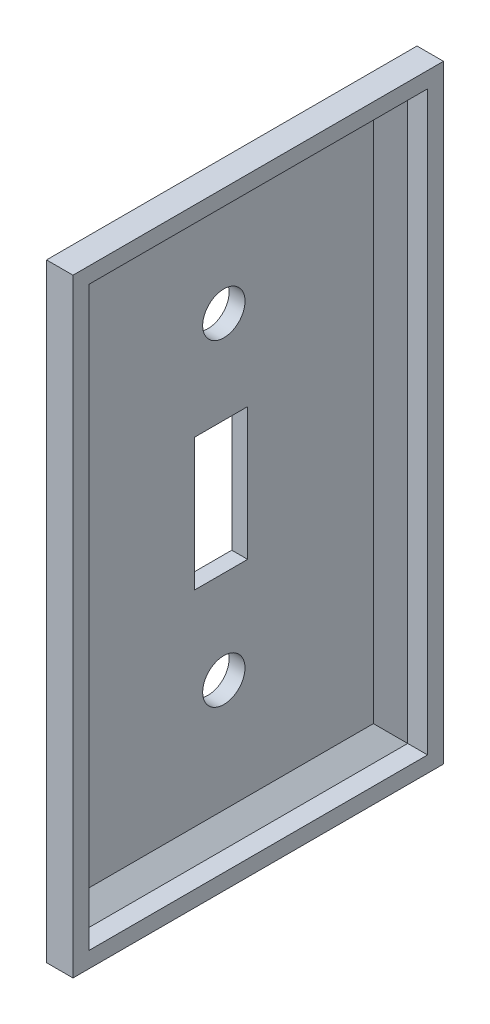
ISO-10303-21;
HEADER;
FILE_DESCRIPTION(('STEP AP214'),'2;1');
FILE_NAME('part.step','',(''),(''),'','','');
FILE_SCHEMA(('AUTOMOTIVE_DESIGN { 1 0 10303 214 1 1 1 1 }'));
ENDSEC;
DATA;
#1=APPLICATION_CONTEXT('core data for automotive mechanical design processes');
#2=APPLICATION_PROTOCOL_DEFINITION('international standard','automotive_design',2000,#1);
#3=PRODUCT_CONTEXT('',#1,'mechanical');
#4=PRODUCT('Part','Part','',(#3));
#5=PRODUCT_RELATED_PRODUCT_CATEGORY('part','',(#4));
#6=PRODUCT_DEFINITION_FORMATION('','',#4);
#7=PRODUCT_DEFINITION_CONTEXT('part definition',#1,'design');
#8=PRODUCT_DEFINITION('design','',#6,#7);
#9=PRODUCT_DEFINITION_SHAPE('','',#8);
#10=(LENGTH_UNIT() NAMED_UNIT(*) SI_UNIT(.MILLI.,.METRE.));
#11=(NAMED_UNIT(*) PLANE_ANGLE_UNIT() SI_UNIT($,.RADIAN.));
#12=(NAMED_UNIT(*) SI_UNIT($,.STERADIAN.) SOLID_ANGLE_UNIT());
#13=UNCERTAINTY_MEASURE_WITH_UNIT(LENGTH_MEASURE(1.E-05),#10,'distance_accuracy_value','');
#14=(GEOMETRIC_REPRESENTATION_CONTEXT(3) GLOBAL_UNCERTAINTY_ASSIGNED_CONTEXT((#13)) GLOBAL_UNIT_ASSIGNED_CONTEXT((#10,
#11,#12)) REPRESENTATION_CONTEXT('',''));
#15=CARTESIAN_POINT('',(0.,0.,0.));
#16=DIRECTION('',(0.,0.,1.));
#17=DIRECTION('',(1.,0.,0.));
#18=AXIS2_PLACEMENT_3D('',#15,#16,#17);
#19=CARTESIAN_POINT('',(10.,0.,0.));
#20=DIRECTION('',(-1.,0.,0.));
#21=DIRECTION('',(0.,0.,1.));
#22=AXIS2_PLACEMENT_3D('',#19,#20,#21);
#23=PLANE('',#22);
#24=DIRECTION('',(0.,-1.,0.));
#25=VECTOR('',#24,1.);
#26=CARTESIAN_POINT('',(10.,0.,0.));
#27=LINE('',#26,#25);
#28=CARTESIAN_POINT('',(10.,115.,0.));
#29=VERTEX_POINT('',#28);
#30=CARTESIAN_POINT('',(10.,0.,0.));
#31=VERTEX_POINT('',#30);
#32=EDGE_CURVE('E236',#29,#31,#27,.T.);
#33=ORIENTED_EDGE('',*,*,#32,.T.);
#34=DIRECTION('',(0.,0.,-1.));
#35=VECTOR('',#34,1.);
#36=CARTESIAN_POINT('',(10.,0.,0.));
#37=LINE('',#36,#35);
#38=CARTESIAN_POINT('',(10.,0.,-70.));
#39=VERTEX_POINT('',#38);
#40=EDGE_CURVE('E239',#31,#39,#37,.T.);
#41=ORIENTED_EDGE('',*,*,#40,.T.);
#42=DIRECTION('',(0.,1.,0.));
#43=VECTOR('',#42,1.);
#44=CARTESIAN_POINT('',(10.,0.,-70.));
#45=LINE('',#44,#43);
#46=CARTESIAN_POINT('',(10.,115.,-70.));
#47=VERTEX_POINT('',#46);
#48=EDGE_CURVE('E241',#39,#47,#45,.T.);
#49=ORIENTED_EDGE('',*,*,#48,.T.);
#50=DIRECTION('',(0.,0.,1.));
#51=VECTOR('',#50,1.);
#52=CARTESIAN_POINT('',(10.,115.,0.));
#53=LINE('',#52,#51);
#54=EDGE_CURVE('E243',#47,#29,#53,.T.);
#55=ORIENTED_EDGE('',*,*,#54,.T.);
#56=EDGE_LOOP('',(#33,#41,#49,#55));
#57=FACE_BOUND('',#56,.T.);
#58=DIRECTION('',(0.,-1.,0.));
#59=VECTOR('',#58,1.);
#60=CARTESIAN_POINT('',(10.,0.,-3.));
#61=LINE('',#60,#59);
#62=CARTESIAN_POINT('',(10.,112.,-3.));
#63=VERTEX_POINT('',#62);
#64=CARTESIAN_POINT('',(10.,3.,-3.));
#65=VERTEX_POINT('',#64);
#66=EDGE_CURVE('E222',#63,#65,#61,.T.);
#67=ORIENTED_EDGE('',*,*,#66,.F.);
#68=DIRECTION('',(0.,0.,1.));
#69=VECTOR('',#68,1.);
#70=CARTESIAN_POINT('',(10.,112.,0.));
#71=LINE('',#70,#69);
#72=CARTESIAN_POINT('',(10.,112.,-67.));
#73=VERTEX_POINT('',#72);
#74=EDGE_CURVE('E191',#73,#63,#71,.T.);
#75=ORIENTED_EDGE('',*,*,#74,.F.);
#76=DIRECTION('',(0.,1.,0.));
#77=VECTOR('',#76,1.);
#78=CARTESIAN_POINT('',(10.,0.,-67.));
#79=LINE('',#78,#77);
#80=CARTESIAN_POINT('',(10.,3.,-67.));
#81=VERTEX_POINT('',#80);
#82=EDGE_CURVE('E232',#81,#73,#79,.T.);
#83=ORIENTED_EDGE('',*,*,#82,.F.);
#84=DIRECTION('',(0.,0.,-1.));
#85=VECTOR('',#84,1.);
#86=CARTESIAN_POINT('',(10.,3.,0.));
#87=LINE('',#86,#85);
#88=EDGE_CURVE('E230',#65,#81,#87,.T.);
#89=ORIENTED_EDGE('',*,*,#88,.F.);
#90=EDGE_LOOP('',(#67,#75,#83,#89));
#91=FACE_BOUND('',#90,.T.);
#92=ADVANCED_FACE('F32',(#57,#91),#23,.F.);
#93=CARTESIAN_POINT('',(10.,0.,0.));
#94=DIRECTION('',(0.,0.,-1.));
#95=DIRECTION('',(-1.,0.,0.));
#96=AXIS2_PLACEMENT_3D('',#93,#94,#95);
#97=PLANE('',#96);
#98=DIRECTION('',(-1.,0.,0.));
#99=VECTOR('',#98,1.);
#100=CARTESIAN_POINT('',(10.,115.,0.));
#101=LINE('',#100,#99);
#102=CARTESIAN_POINT('',(5.00000000000002,115.,0.));
#103=VERTEX_POINT('',#102);
#104=EDGE_CURVE('E245',#29,#103,#101,.T.);
#105=ORIENTED_EDGE('',*,*,#104,.T.);
#106=DIRECTION('',(0.,-1.,0.));
#107=VECTOR('',#106,1.);
#108=CARTESIAN_POINT('',(5.00000000000002,0.,0.));
#109=LINE('',#108,#107);
#110=CARTESIAN_POINT('',(5.00000000000002,0.,0.));
#111=VERTEX_POINT('',#110);
#112=EDGE_CURVE('E11',#103,#111,#109,.T.);
#113=ORIENTED_EDGE('',*,*,#112,.T.);
#114=DIRECTION('',(-1.,0.,0.));
#115=VECTOR('',#114,1.);
#116=CARTESIAN_POINT('',(10.,0.,0.));
#117=LINE('',#116,#115);
#118=EDGE_CURVE('E254',#31,#111,#117,.T.);
#119=ORIENTED_EDGE('',*,*,#118,.F.);
#120=ORIENTED_EDGE('',*,*,#32,.F.);
#121=EDGE_LOOP('',(#105,#113,#119,#120));
#122=FACE_BOUND('',#121,.T.);
#123=ADVANCED_FACE('F310',(#122),#97,.F.);
#124=CARTESIAN_POINT('',(10.,0.,0.));
#125=DIRECTION('',(0.,1.,0.));
#126=DIRECTION('',(0.,0.,1.));
#127=AXIS2_PLACEMENT_3D('',#124,#125,#126);
#128=PLANE('',#127);
#129=ORIENTED_EDGE('',*,*,#118,.T.);
#130=DIRECTION('',(0.,0.,-1.));
#131=VECTOR('',#130,1.);
#132=CARTESIAN_POINT('',(5.00000000000002,0.,-70.));
#133=LINE('',#132,#131);
#134=CARTESIAN_POINT('',(5.00000000000002,0.,-70.));
#135=VERTEX_POINT('',#134);
#136=EDGE_CURVE('E257',#111,#135,#133,.T.);
#137=ORIENTED_EDGE('',*,*,#136,.T.);
#138=DIRECTION('',(-1.,0.,0.));
#139=VECTOR('',#138,1.);
#140=CARTESIAN_POINT('',(10.,0.,-70.));
#141=LINE('',#140,#139);
#142=EDGE_CURVE('E251',#39,#135,#141,.T.);
#143=ORIENTED_EDGE('',*,*,#142,.F.);
#144=ORIENTED_EDGE('',*,*,#40,.F.);
#145=EDGE_LOOP('',(#129,#137,#143,#144));
#146=FACE_BOUND('',#145,.T.);
#147=ADVANCED_FACE('F300',(#146),#128,.F.);
#148=CARTESIAN_POINT('',(10.,0.,-70.));
#149=DIRECTION('',(0.,0.,1.));
#150=DIRECTION('',(1.,0.,0.));
#151=AXIS2_PLACEMENT_3D('',#148,#149,#150);
#152=PLANE('',#151);
#153=ORIENTED_EDGE('',*,*,#142,.T.);
#154=DIRECTION('',(0.,1.,0.));
#155=VECTOR('',#154,1.);
#156=CARTESIAN_POINT('',(5.00000000000002,115.,-70.));
#157=LINE('',#156,#155);
#158=CARTESIAN_POINT('',(5.00000000000002,115.,-70.));
#159=VERTEX_POINT('',#158);
#160=EDGE_CURVE('E269',#135,#159,#157,.T.);
#161=ORIENTED_EDGE('',*,*,#160,.T.);
#162=DIRECTION('',(-1.,0.,0.));
#163=VECTOR('',#162,1.);
#164=CARTESIAN_POINT('',(10.,115.,-70.));
#165=LINE('',#164,#163);
#166=EDGE_CURVE('E248',#47,#159,#165,.T.);
#167=ORIENTED_EDGE('',*,*,#166,.F.);
#168=ORIENTED_EDGE('',*,*,#48,.F.);
#169=EDGE_LOOP('',(#153,#161,#167,#168));
#170=FACE_BOUND('',#169,.T.);
#171=ADVANCED_FACE('F303',(#170),#152,.F.);
#172=CARTESIAN_POINT('',(10.,115.,0.));
#173=DIRECTION('',(0.,-1.,0.));
#174=DIRECTION('',(0.,0.,-1.));
#175=AXIS2_PLACEMENT_3D('',#172,#173,#174);
#176=PLANE('',#175);
#177=ORIENTED_EDGE('',*,*,#166,.T.);
#178=DIRECTION('',(0.,0.,1.));
#179=VECTOR('',#178,1.);
#180=CARTESIAN_POINT('',(5.00000000000002,115.,0.));
#181=LINE('',#180,#179);
#182=EDGE_CURVE('E41',#159,#103,#181,.T.);
#183=ORIENTED_EDGE('',*,*,#182,.T.);
#184=ORIENTED_EDGE('',*,*,#104,.F.);
#185=ORIENTED_EDGE('',*,*,#54,.F.);
#186=EDGE_LOOP('',(#177,#183,#184,#185));
#187=FACE_BOUND('',#186,.T.);
#188=ADVANCED_FACE('F312',(#187),#176,.F.);
#189=CARTESIAN_POINT('',(0.,0.,0.));
#190=DIRECTION('',(-1.,0.,0.));
#191=DIRECTION('',(0.,0.,1.));
#192=AXIS2_PLACEMENT_3D('',#189,#190,#191);
#193=PLANE('',#192);
#194=CARTESIAN_POINT('',(0.,27.5,-35.5));
#195=DIRECTION('',(1.,0.,0.));
#196=DIRECTION('',(0.,0.,-1.));
#197=AXIS2_PLACEMENT_3D('',#194,#195,#196);
#198=CIRCLE('',#197,4.00000000000001);
#199=CARTESIAN_POINT('',(0.,27.5,-39.5));
#200=VERTEX_POINT('',#199);
#201=EDGE_CURVE('E388',#200,#200,#198,.T.);
#202=ORIENTED_EDGE('',*,*,#201,.T.);
#203=EDGE_LOOP('',(#202));
#204=FACE_BOUND('',#203,.T.);
#205=CARTESIAN_POINT('',(0.,87.5,-35.5));
#206=DIRECTION('',(1.,0.,0.));
#207=DIRECTION('',(0.,0.,-1.));
#208=AXIS2_PLACEMENT_3D('',#205,#206,#207);
#209=CIRCLE('',#208,4.00000000000001);
#210=CARTESIAN_POINT('',(0.,87.5,-39.5));
#211=VERTEX_POINT('',#210);
#212=EDGE_CURVE('E177',#211,#211,#209,.T.);
#213=ORIENTED_EDGE('',*,*,#212,.T.);
#214=EDGE_LOOP('',(#213));
#215=FACE_BOUND('',#214,.T.);
#216=DIRECTION('',(0.,-1.,0.));
#217=VECTOR('',#216,1.);
#218=CARTESIAN_POINT('',(0.,70.,-30.));
#219=LINE('',#218,#217);
#220=CARTESIAN_POINT('',(0.,70.,-30.));
#221=VERTEX_POINT('',#220);
#222=CARTESIAN_POINT('',(0.,45.,-30.));
#223=VERTEX_POINT('',#222);
#224=EDGE_CURVE('E148',#221,#223,#219,.T.);
#225=ORIENTED_EDGE('',*,*,#224,.T.);
#226=DIRECTION('',(0.,0.,-1.));
#227=VECTOR('',#226,1.);
#228=CARTESIAN_POINT('',(0.,45.,-30.));
#229=LINE('',#228,#227);
#230=CARTESIAN_POINT('',(0.,45.,-40.));
#231=VERTEX_POINT('',#230);
#232=EDGE_CURVE('E157',#223,#231,#229,.T.);
#233=ORIENTED_EDGE('',*,*,#232,.T.);
#234=DIRECTION('',(0.,1.,0.));
#235=VECTOR('',#234,1.);
#236=CARTESIAN_POINT('',(0.,70.,-40.));
#237=LINE('',#236,#235);
#238=CARTESIAN_POINT('',(0.,70.,-40.));
#239=VERTEX_POINT('',#238);
#240=EDGE_CURVE('E49',#231,#239,#237,.T.);
#241=ORIENTED_EDGE('',*,*,#240,.T.);
#242=DIRECTION('',(0.,0.,1.));
#243=VECTOR('',#242,1.);
#244=CARTESIAN_POINT('',(0.,70.,-30.));
#245=LINE('',#244,#243);
#246=EDGE_CURVE('E154',#239,#221,#245,.T.);
#247=ORIENTED_EDGE('',*,*,#246,.T.);
#248=EDGE_LOOP('',(#225,#233,#241,#247));
#249=FACE_BOUND('',#248,.T.);
#250=DIRECTION('',(0.,-1.,0.));
#251=VECTOR('',#250,1.);
#252=CARTESIAN_POINT('',(0.,0.,-65.));
#253=LINE('',#252,#251);
#254=CARTESIAN_POINT('',(0.,110.,-65.));
#255=VERTEX_POINT('',#254);
#256=CARTESIAN_POINT('',(0.,5.00000000000003,-65.));
#257=VERTEX_POINT('',#256);
#258=EDGE_CURVE('E264',#255,#257,#253,.T.);
#259=ORIENTED_EDGE('',*,*,#258,.T.);
#260=DIRECTION('',(0.,0.,1.));
#261=VECTOR('',#260,1.);
#262=CARTESIAN_POINT('',(0.,5.00000000000003,0.));
#263=LINE('',#262,#261);
#264=CARTESIAN_POINT('',(0.,5.00000000000003,-5.00000000000003));
#265=VERTEX_POINT('',#264);
#266=EDGE_CURVE('E266',#257,#265,#263,.T.);
#267=ORIENTED_EDGE('',*,*,#266,.T.);
#268=DIRECTION('',(0.,1.,0.));
#269=VECTOR('',#268,1.);
#270=CARTESIAN_POINT('',(0.,115.,-5.00000000000003));
#271=LINE('',#270,#269);
#272=CARTESIAN_POINT('',(0.,110.,-5.00000000000003));
#273=VERTEX_POINT('',#272);
#274=EDGE_CURVE('E260',#265,#273,#271,.T.);
#275=ORIENTED_EDGE('',*,*,#274,.T.);
#276=DIRECTION('',(0.,0.,-1.));
#277=VECTOR('',#276,1.);
#278=CARTESIAN_POINT('',(0.,110.,-70.));
#279=LINE('',#278,#277);
#280=EDGE_CURVE('E262',#273,#255,#279,.T.);
#281=ORIENTED_EDGE('',*,*,#280,.T.);
#282=EDGE_LOOP('',(#259,#267,#275,#281));
#283=FACE_BOUND('',#282,.T.);
#284=ADVANCED_FACE('F161',(#204,#215,#249,#283),#193,.T.);
#285=CARTESIAN_POINT('',(5.00000000000002,115.,0.));
#286=DIRECTION('',(-0.707106781186548,0.707106781186546,0.));
#287=DIRECTION('',(0.,0.,-1.));
#288=AXIS2_PLACEMENT_3D('',#285,#286,#287);
#289=PLANE('',#288);
#290=DIRECTION('',(-0.577350269189625,-0.577350269189626,0.577350269189626));
#291=VECTOR('',#290,1.);
#292=CARTESIAN_POINT('',(-18.3333333333333,91.6666666666666,-46.6666666666666));
#293=LINE('',#292,#291);
#294=EDGE_CURVE('E274',#255,#159,#293,.F.);
#295=ORIENTED_EDGE('',*,*,#294,.F.);
#296=ORIENTED_EDGE('',*,*,#280,.F.);
#297=DIRECTION('',(-0.577350269189625,-0.577350269189626,-0.577350269189626));
#298=VECTOR('',#297,1.);
#299=CARTESIAN_POINT('',(-33.3333333333333,76.6666666666666,-38.3333333333334));
#300=LINE('',#299,#298);
#301=EDGE_CURVE('E36',#103,#273,#300,.T.);
#302=ORIENTED_EDGE('',*,*,#301,.F.);
#303=ORIENTED_EDGE('',*,*,#182,.F.);
#304=EDGE_LOOP('',(#295,#296,#302,#303));
#305=FACE_BOUND('',#304,.T.);
#306=ADVANCED_FACE('F34',(#305),#289,.T.);
#307=CARTESIAN_POINT('',(5.00000000000002,0.,0.));
#308=DIRECTION('',(-0.707106781186548,0.,0.707106781186546));
#309=DIRECTION('',(0.,1.,0.));
#310=AXIS2_PLACEMENT_3D('',#307,#308,#309);
#311=PLANE('',#310);
#312=ORIENTED_EDGE('',*,*,#301,.T.);
#313=ORIENTED_EDGE('',*,*,#274,.F.);
#314=DIRECTION('',(0.577350269189625,-0.577350269189626,0.577350269189626));
#315=VECTOR('',#314,1.);
#316=CARTESIAN_POINT('',(5.00000000000002,0.,0.));
#317=LINE('',#316,#315);
#318=EDGE_CURVE('E273',#111,#265,#317,.F.);
#319=ORIENTED_EDGE('',*,*,#318,.F.);
#320=ORIENTED_EDGE('',*,*,#112,.F.);
#321=EDGE_LOOP('',(#312,#313,#319,#320));
#322=FACE_BOUND('',#321,.T.);
#323=ADVANCED_FACE('F285',(#322),#311,.T.);
#324=CARTESIAN_POINT('',(5.00000000000002,0.,-70.));
#325=DIRECTION('',(-0.707106781186548,0.,-0.707106781186546));
#326=DIRECTION('',(0.,-1.,0.));
#327=AXIS2_PLACEMENT_3D('',#324,#325,#326);
#328=PLANE('',#327);
#329=ORIENTED_EDGE('',*,*,#294,.T.);
#330=ORIENTED_EDGE('',*,*,#160,.F.);
#331=DIRECTION('',(-0.577350269189625,0.577350269189626,0.577350269189626));
#332=VECTOR('',#331,1.);
#333=CARTESIAN_POINT('',(5.00000000000002,0.,-70.));
#334=LINE('',#333,#332);
#335=EDGE_CURVE('E194',#257,#135,#334,.F.);
#336=ORIENTED_EDGE('',*,*,#335,.F.);
#337=ORIENTED_EDGE('',*,*,#258,.F.);
#338=EDGE_LOOP('',(#329,#330,#336,#337));
#339=FACE_BOUND('',#338,.T.);
#340=ADVANCED_FACE('F295',(#339),#328,.T.);
#341=CARTESIAN_POINT('',(5.00000000000002,0.,0.));
#342=DIRECTION('',(-0.707106781186548,-0.707106781186546,0.));
#343=DIRECTION('',(0.,0.,1.));
#344=AXIS2_PLACEMENT_3D('',#341,#342,#343);
#345=PLANE('',#344);
#346=ORIENTED_EDGE('',*,*,#318,.T.);
#347=ORIENTED_EDGE('',*,*,#266,.F.);
#348=ORIENTED_EDGE('',*,*,#335,.T.);
#349=ORIENTED_EDGE('',*,*,#136,.F.);
#350=EDGE_LOOP('',(#346,#347,#348,#349));
#351=FACE_BOUND('',#350,.T.);
#352=ADVANCED_FACE('F293',(#351),#345,.T.);
#353=CARTESIAN_POINT('',(10.,0.,-3.));
#354=DIRECTION('',(0.,0.,-1.));
#355=DIRECTION('',(-1.,0.,0.));
#356=AXIS2_PLACEMENT_3D('',#353,#354,#355);
#357=PLANE('',#356);
#358=DIRECTION('',(-1.,0.,0.));
#359=VECTOR('',#358,1.);
#360=CARTESIAN_POINT('',(10.,112.,-3.));
#361=LINE('',#360,#359);
#362=CARTESIAN_POINT('',(6.2426406871193,112.,-3.00000000000001));
#363=VERTEX_POINT('',#362);
#364=EDGE_CURVE('E187',#63,#363,#361,.T.);
#365=ORIENTED_EDGE('',*,*,#364,.F.);
#366=ORIENTED_EDGE('',*,*,#66,.T.);
#367=DIRECTION('',(-1.,0.,0.));
#368=VECTOR('',#367,1.);
#369=CARTESIAN_POINT('',(10.,3.,-3.));
#370=LINE('',#369,#368);
#371=CARTESIAN_POINT('',(6.24264068711931,3.,-3.));
#372=VERTEX_POINT('',#371);
#373=EDGE_CURVE('E196',#65,#372,#370,.T.);
#374=ORIENTED_EDGE('',*,*,#373,.T.);
#375=DIRECTION('',(0.,-1.,0.));
#376=VECTOR('',#375,1.);
#377=CARTESIAN_POINT('',(6.24264068711931,0.,-3.));
#378=LINE('',#377,#376);
#379=EDGE_CURVE('E192',#363,#372,#378,.T.);
#380=ORIENTED_EDGE('',*,*,#379,.F.);
#381=EDGE_LOOP('',(#365,#366,#374,#380));
#382=FACE_BOUND('',#381,.T.);
#383=ADVANCED_FACE('F360',(#382),#357,.T.);
#384=CARTESIAN_POINT('',(10.,3.,0.));
#385=DIRECTION('',(0.,1.,0.));
#386=DIRECTION('',(0.,0.,1.));
#387=AXIS2_PLACEMENT_3D('',#384,#385,#386);
#388=PLANE('',#387);
#389=ORIENTED_EDGE('',*,*,#373,.F.);
#390=ORIENTED_EDGE('',*,*,#88,.T.);
#391=DIRECTION('',(-1.,0.,0.));
#392=VECTOR('',#391,1.);
#393=CARTESIAN_POINT('',(10.,3.,-67.));
#394=LINE('',#393,#392);
#395=CARTESIAN_POINT('',(6.2426406871193,3.,-67.));
#396=VERTEX_POINT('',#395);
#397=EDGE_CURVE('E200',#81,#396,#394,.T.);
#398=ORIENTED_EDGE('',*,*,#397,.T.);
#399=DIRECTION('',(0.,0.,-1.));
#400=VECTOR('',#399,1.);
#401=CARTESIAN_POINT('',(6.24264068711931,3.,0.));
#402=LINE('',#401,#400);
#403=EDGE_CURVE('E199',#372,#396,#402,.T.);
#404=ORIENTED_EDGE('',*,*,#403,.F.);
#405=EDGE_LOOP('',(#389,#390,#398,#404));
#406=FACE_BOUND('',#405,.T.);
#407=ADVANCED_FACE('F356',(#406),#388,.T.);
#408=CARTESIAN_POINT('',(10.,0.,-67.));
#409=DIRECTION('',(0.,0.,1.));
#410=DIRECTION('',(1.,0.,0.));
#411=AXIS2_PLACEMENT_3D('',#408,#409,#410);
#412=PLANE('',#411);
#413=ORIENTED_EDGE('',*,*,#397,.F.);
#414=ORIENTED_EDGE('',*,*,#82,.T.);
#415=DIRECTION('',(-1.,0.,0.));
#416=VECTOR('',#415,1.);
#417=CARTESIAN_POINT('',(10.,112.,-67.));
#418=LINE('',#417,#416);
#419=CARTESIAN_POINT('',(6.2426406871193,112.,-67.));
#420=VERTEX_POINT('',#419);
#421=EDGE_CURVE('E190',#73,#420,#418,.T.);
#422=ORIENTED_EDGE('',*,*,#421,.T.);
#423=DIRECTION('',(0.,1.,0.));
#424=VECTOR('',#423,1.);
#425=CARTESIAN_POINT('',(6.2426406871193,0.,-67.));
#426=LINE('',#425,#424);
#427=EDGE_CURVE('E206',#396,#420,#426,.T.);
#428=ORIENTED_EDGE('',*,*,#427,.F.);
#429=EDGE_LOOP('',(#413,#414,#422,#428));
#430=FACE_BOUND('',#429,.T.);
#431=ADVANCED_FACE('F352',(#430),#412,.T.);
#432=CARTESIAN_POINT('',(10.,112.,0.));
#433=DIRECTION('',(0.,-1.,0.));
#434=DIRECTION('',(0.,0.,-1.));
#435=AXIS2_PLACEMENT_3D('',#432,#433,#434);
#436=PLANE('',#435);
#437=ORIENTED_EDGE('',*,*,#421,.F.);
#438=ORIENTED_EDGE('',*,*,#74,.T.);
#439=ORIENTED_EDGE('',*,*,#364,.T.);
#440=DIRECTION('',(0.,0.,1.));
#441=VECTOR('',#440,1.);
#442=CARTESIAN_POINT('',(6.2426406871193,112.,0.));
#443=LINE('',#442,#441);
#444=EDGE_CURVE('E195',#420,#363,#443,.T.);
#445=ORIENTED_EDGE('',*,*,#444,.F.);
#446=EDGE_LOOP('',(#437,#438,#439,#445));
#447=FACE_BOUND('',#446,.T.);
#448=ADVANCED_FACE('F348',(#447),#436,.T.);
#449=CARTESIAN_POINT('',(3.,0.,0.));
#450=DIRECTION('',(-1.,0.,0.));
#451=DIRECTION('',(0.,0.,1.));
#452=AXIS2_PLACEMENT_3D('',#449,#450,#451);
#453=PLANE('',#452);
#454=CARTESIAN_POINT('',(3.,27.5,-35.5));
#455=DIRECTION('',(1.,0.,0.));
#456=DIRECTION('',(0.,0.,-1.));
#457=AXIS2_PLACEMENT_3D('',#454,#455,#456);
#458=CIRCLE('',#457,4.00000000000001);
#459=CARTESIAN_POINT('',(3.,27.5,-39.5));
#460=VERTEX_POINT('',#459);
#461=EDGE_CURVE('E391',#460,#460,#458,.T.);
#462=ORIENTED_EDGE('',*,*,#461,.F.);
#463=EDGE_LOOP('',(#462));
#464=FACE_BOUND('',#463,.T.);
#465=CARTESIAN_POINT('',(3.,87.5,-35.5));
#466=DIRECTION('',(1.,0.,0.));
#467=DIRECTION('',(0.,0.,-1.));
#468=AXIS2_PLACEMENT_3D('',#465,#466,#467);
#469=CIRCLE('',#468,4.00000000000001);
#470=CARTESIAN_POINT('',(3.,87.5,-39.5));
#471=VERTEX_POINT('',#470);
#472=EDGE_CURVE('E170',#471,#471,#469,.T.);
#473=ORIENTED_EDGE('',*,*,#472,.F.);
#474=EDGE_LOOP('',(#473));
#475=FACE_BOUND('',#474,.T.);
#476=DIRECTION('',(0.,0.,-1.));
#477=VECTOR('',#476,1.);
#478=CARTESIAN_POINT('',(3.,45.,-30.));
#479=LINE('',#478,#477);
#480=CARTESIAN_POINT('',(3.,45.,-30.));
#481=VERTEX_POINT('',#480);
#482=CARTESIAN_POINT('',(3.,45.,-40.));
#483=VERTEX_POINT('',#482);
#484=EDGE_CURVE('E176',#481,#483,#479,.T.);
#485=ORIENTED_EDGE('',*,*,#484,.F.);
#486=DIRECTION('',(0.,-1.,0.));
#487=VECTOR('',#486,1.);
#488=CARTESIAN_POINT('',(3.,70.,-30.));
#489=LINE('',#488,#487);
#490=CARTESIAN_POINT('',(3.,70.,-30.));
#491=VERTEX_POINT('',#490);
#492=EDGE_CURVE('E57',#491,#481,#489,.T.);
#493=ORIENTED_EDGE('',*,*,#492,.F.);
#494=DIRECTION('',(0.,0.,1.));
#495=VECTOR('',#494,1.);
#496=CARTESIAN_POINT('',(3.,70.,-30.));
#497=LINE('',#496,#495);
#498=CARTESIAN_POINT('',(3.,70.,-40.));
#499=VERTEX_POINT('',#498);
#500=EDGE_CURVE('E164',#499,#491,#497,.T.);
#501=ORIENTED_EDGE('',*,*,#500,.F.);
#502=DIRECTION('',(0.,1.,0.));
#503=VECTOR('',#502,1.);
#504=CARTESIAN_POINT('',(3.,70.,-40.));
#505=LINE('',#504,#503);
#506=EDGE_CURVE('E167',#483,#499,#505,.T.);
#507=ORIENTED_EDGE('',*,*,#506,.F.);
#508=EDGE_LOOP('',(#485,#493,#501,#507));
#509=FACE_BOUND('',#508,.T.);
#510=DIRECTION('',(0.,-1.,0.));
#511=VECTOR('',#510,1.);
#512=CARTESIAN_POINT('',(3.,0.,-63.7573593128807));
#513=LINE('',#512,#511);
#514=CARTESIAN_POINT('',(3.,108.757359312881,-63.7573593128807));
#515=VERTEX_POINT('',#514);
#516=CARTESIAN_POINT('',(3.,6.24264068711931,-63.7573593128807));
#517=VERTEX_POINT('',#516);
#518=EDGE_CURVE('E219',#515,#517,#513,.T.);
#519=ORIENTED_EDGE('',*,*,#518,.F.);
#520=DIRECTION('',(0.,0.,-1.));
#521=VECTOR('',#520,1.);
#522=CARTESIAN_POINT('',(3.,108.757359312881,0.));
#523=LINE('',#522,#521);
#524=CARTESIAN_POINT('',(3.,108.757359312881,-6.24264068711931));
#525=VERTEX_POINT('',#524);
#526=EDGE_CURVE('E217',#525,#515,#523,.T.);
#527=ORIENTED_EDGE('',*,*,#526,.F.);
#528=DIRECTION('',(0.,1.,0.));
#529=VECTOR('',#528,1.);
#530=CARTESIAN_POINT('',(3.,0.,-6.24264068711931));
#531=LINE('',#530,#529);
#532=CARTESIAN_POINT('',(3.,6.24264068711931,-6.24264068711931));
#533=VERTEX_POINT('',#532);
#534=EDGE_CURVE('E203',#533,#525,#531,.T.);
#535=ORIENTED_EDGE('',*,*,#534,.F.);
#536=DIRECTION('',(0.,0.,1.));
#537=VECTOR('',#536,1.);
#538=CARTESIAN_POINT('',(3.,6.24264068711931,0.));
#539=LINE('',#538,#537);
#540=EDGE_CURVE('E208',#517,#533,#539,.T.);
#541=ORIENTED_EDGE('',*,*,#540,.F.);
#542=EDGE_LOOP('',(#519,#527,#535,#541));
#543=FACE_BOUND('',#542,.T.);
#544=ADVANCED_FACE('F344',(#464,#475,#509,#543),#453,.F.);
#545=CARTESIAN_POINT('',(7.12132034355966,112.87867965644,0.));
#546=DIRECTION('',(-0.707106781186548,0.707106781186546,0.));
#547=DIRECTION('',(0.,0.,-1.));
#548=AXIS2_PLACEMENT_3D('',#545,#546,#547);
#549=PLANE('',#548);
#550=DIRECTION('',(0.577350269189625,0.577350269189626,-0.577350269189626));
#551=VECTOR('',#550,1.);
#552=CARTESIAN_POINT('',(-30.5049062085871,75.2524531042935,-30.2524531042935));
#553=LINE('',#552,#551);
#554=EDGE_CURVE('E212',#515,#420,#553,.T.);
#555=ORIENTED_EDGE('',*,*,#554,.T.);
#556=ORIENTED_EDGE('',*,*,#444,.T.);
#557=DIRECTION('',(-0.577350269189625,-0.577350269189626,-0.577350269189626));
#558=VECTOR('',#557,1.);
#559=CARTESIAN_POINT('',(-30.5049062085871,75.2524531042935,-39.7475468957065));
#560=LINE('',#559,#558);
#561=EDGE_CURVE('E215',#363,#525,#560,.T.);
#562=ORIENTED_EDGE('',*,*,#561,.T.);
#563=ORIENTED_EDGE('',*,*,#526,.T.);
#564=EDGE_LOOP('',(#555,#556,#562,#563));
#565=FACE_BOUND('',#564,.T.);
#566=ADVANCED_FACE('F340',(#565),#549,.F.);
#567=CARTESIAN_POINT('',(7.12132034355966,0.,-2.12132034355964));
#568=DIRECTION('',(-0.707106781186548,0.,0.707106781186546));
#569=DIRECTION('',(0.,1.,0.));
#570=AXIS2_PLACEMENT_3D('',#567,#568,#569);
#571=PLANE('',#570);
#572=ORIENTED_EDGE('',*,*,#561,.F.);
#573=ORIENTED_EDGE('',*,*,#379,.T.);
#574=DIRECTION('',(-0.577350269189625,0.577350269189626,-0.577350269189626));
#575=VECTOR('',#574,1.);
#576=CARTESIAN_POINT('',(7.82842712474621,1.41421356237309,-1.41421356237309));
#577=LINE('',#576,#575);
#578=EDGE_CURVE('E216',#372,#533,#577,.T.);
#579=ORIENTED_EDGE('',*,*,#578,.T.);
#580=ORIENTED_EDGE('',*,*,#534,.T.);
#581=EDGE_LOOP('',(#572,#573,#579,#580));
#582=FACE_BOUND('',#581,.T.);
#583=ADVANCED_FACE('F336',(#582),#571,.F.);
#584=CARTESIAN_POINT('',(7.12132034355966,0.,-67.8786796564404));
#585=DIRECTION('',(-0.707106781186548,0.,-0.707106781186546));
#586=DIRECTION('',(0.,-1.,0.));
#587=AXIS2_PLACEMENT_3D('',#584,#585,#586);
#588=PLANE('',#587);
#589=ORIENTED_EDGE('',*,*,#554,.F.);
#590=ORIENTED_EDGE('',*,*,#518,.T.);
#591=DIRECTION('',(0.577350269189625,-0.577350269189626,-0.577350269189626));
#592=VECTOR('',#591,1.);
#593=CARTESIAN_POINT('',(-15.5049062085871,24.7475468957065,-45.2524531042935));
#594=LINE('',#593,#592);
#595=EDGE_CURVE('E183',#517,#396,#594,.T.);
#596=ORIENTED_EDGE('',*,*,#595,.T.);
#597=ORIENTED_EDGE('',*,*,#427,.T.);
#598=EDGE_LOOP('',(#589,#590,#596,#597));
#599=FACE_BOUND('',#598,.T.);
#600=ADVANCED_FACE('F332',(#599),#588,.F.);
#601=CARTESIAN_POINT('',(7.12132034355966,2.12132034355964,0.));
#602=DIRECTION('',(-0.707106781186548,-0.707106781186546,0.));
#603=DIRECTION('',(0.,0.,1.));
#604=AXIS2_PLACEMENT_3D('',#601,#602,#603);
#605=PLANE('',#604);
#606=ORIENTED_EDGE('',*,*,#578,.F.);
#607=ORIENTED_EDGE('',*,*,#403,.T.);
#608=ORIENTED_EDGE('',*,*,#595,.F.);
#609=ORIENTED_EDGE('',*,*,#540,.T.);
#610=EDGE_LOOP('',(#606,#607,#608,#609));
#611=FACE_BOUND('',#610,.T.);
#612=ADVANCED_FACE('F329',(#611),#605,.F.);
#613=CARTESIAN_POINT('',(0.,70.,-30.));
#614=DIRECTION('',(0.,0.,1.));
#615=DIRECTION('',(1.,0.,0.));
#616=AXIS2_PLACEMENT_3D('',#613,#614,#615);
#617=PLANE('',#616);
#618=ORIENTED_EDGE('',*,*,#492,.T.);
#619=DIRECTION('',(1.,0.,0.));
#620=VECTOR('',#619,1.);
#621=CARTESIAN_POINT('',(0.,45.,-30.));
#622=LINE('',#621,#620);
#623=EDGE_CURVE('E144',#223,#481,#622,.T.);
#624=ORIENTED_EDGE('',*,*,#623,.F.);
#625=ORIENTED_EDGE('',*,*,#224,.F.);
#626=DIRECTION('',(1.,0.,0.));
#627=VECTOR('',#626,1.);
#628=CARTESIAN_POINT('',(0.,70.,-30.));
#629=LINE('',#628,#627);
#630=EDGE_CURVE('E181',#221,#491,#629,.T.);
#631=ORIENTED_EDGE('',*,*,#630,.T.);
#632=EDGE_LOOP('',(#618,#624,#625,#631));
#633=FACE_BOUND('',#632,.T.);
#634=ADVANCED_FACE('F146',(#633),#617,.F.);
#635=CARTESIAN_POINT('',(0.,70.,-30.));
#636=DIRECTION('',(0.,1.,0.));
#637=DIRECTION('',(0.,0.,1.));
#638=AXIS2_PLACEMENT_3D('',#635,#636,#637);
#639=PLANE('',#638);
#640=ORIENTED_EDGE('',*,*,#500,.T.);
#641=ORIENTED_EDGE('',*,*,#630,.F.);
#642=ORIENTED_EDGE('',*,*,#246,.F.);
#643=DIRECTION('',(1.,0.,0.));
#644=VECTOR('',#643,1.);
#645=CARTESIAN_POINT('',(0.,70.,-40.));
#646=LINE('',#645,#644);
#647=EDGE_CURVE('E184',#239,#499,#646,.T.);
#648=ORIENTED_EDGE('',*,*,#647,.T.);
#649=EDGE_LOOP('',(#640,#641,#642,#648));
#650=FACE_BOUND('',#649,.T.);
#651=ADVANCED_FACE('F367',(#650),#639,.F.);
#652=CARTESIAN_POINT('',(0.,70.,-40.));
#653=DIRECTION('',(0.,0.,-1.));
#654=DIRECTION('',(-1.,0.,0.));
#655=AXIS2_PLACEMENT_3D('',#652,#653,#654);
#656=PLANE('',#655);
#657=ORIENTED_EDGE('',*,*,#506,.T.);
#658=ORIENTED_EDGE('',*,*,#647,.F.);
#659=ORIENTED_EDGE('',*,*,#240,.F.);
#660=DIRECTION('',(1.,0.,0.));
#661=VECTOR('',#660,1.);
#662=CARTESIAN_POINT('',(0.,45.,-40.));
#663=LINE('',#662,#661);
#664=EDGE_CURVE('E153',#231,#483,#663,.T.);
#665=ORIENTED_EDGE('',*,*,#664,.T.);
#666=EDGE_LOOP('',(#657,#658,#659,#665));
#667=FACE_BOUND('',#666,.T.);
#668=ADVANCED_FACE('F371',(#667),#656,.F.);
#669=CARTESIAN_POINT('',(0.,45.,-30.));
#670=DIRECTION('',(0.,-1.,0.));
#671=DIRECTION('',(0.,0.,-1.));
#672=AXIS2_PLACEMENT_3D('',#669,#670,#671);
#673=PLANE('',#672);
#674=ORIENTED_EDGE('',*,*,#484,.T.);
#675=ORIENTED_EDGE('',*,*,#664,.F.);
#676=ORIENTED_EDGE('',*,*,#232,.F.);
#677=ORIENTED_EDGE('',*,*,#623,.T.);
#678=EDGE_LOOP('',(#674,#675,#676,#677));
#679=FACE_BOUND('',#678,.T.);
#680=ADVANCED_FACE('F158',(#679),#673,.F.);
#681=CARTESIAN_POINT('',(0.,87.5,-35.5));
#682=DIRECTION('',(1.,0.,0.));
#683=DIRECTION('',(0.,0.,-1.));
#684=AXIS2_PLACEMENT_3D('',#681,#682,#683);
#685=CYLINDRICAL_SURFACE('',#684,4.00000000000001);
#686=ORIENTED_EDGE('',*,*,#212,.F.);
#687=EDGE_LOOP('',(#686));
#688=FACE_BOUND('',#687,.T.);
#689=ORIENTED_EDGE('',*,*,#472,.T.);
#690=EDGE_LOOP('',(#689));
#691=FACE_BOUND('',#690,.T.);
#692=ADVANCED_FACE('F370',(#688,#691),#685,.F.);
#693=CARTESIAN_POINT('',(0.,27.5,-35.5));
#694=DIRECTION('',(1.,0.,0.));
#695=DIRECTION('',(0.,0.,-1.));
#696=AXIS2_PLACEMENT_3D('',#693,#694,#695);
#697=CYLINDRICAL_SURFACE('',#696,4.00000000000001);
#698=ORIENTED_EDGE('',*,*,#201,.F.);
#699=EDGE_LOOP('',(#698));
#700=FACE_BOUND('',#699,.T.);
#701=ORIENTED_EDGE('',*,*,#461,.T.);
#702=EDGE_LOOP('',(#701));
#703=FACE_BOUND('',#702,.T.);
#704=ADVANCED_FACE('F379',(#700,#703),#697,.F.);
#705=CLOSED_SHELL('',(#92,#123,#147,#171,#188,#284,#306,#323,#340,#352,#383,#407,#431,#448,#544,
#566,#583,#600,#612,#634,#651,#668,#680,#692,#704));
#706=MANIFOLD_SOLID_BREP('B2',#705);
#707=ADVANCED_BREP_SHAPE_REPRESENTATION('',(#18,#706),#14);
#708=SHAPE_DEFINITION_REPRESENTATION(#9,#707);
ENDSEC;
END-ISO-10303-21;
